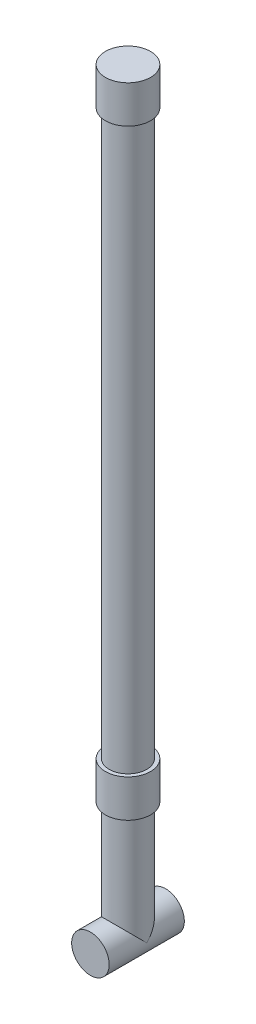
ISO-10303-21;
HEADER;
FILE_DESCRIPTION(('STEP AP214'),'2;1');
FILE_NAME('part.step','',(''),(''),'','','');
FILE_SCHEMA(('AUTOMOTIVE_DESIGN { 1 0 10303 214 1 1 1 1 }'));
ENDSEC;
DATA;
#1=APPLICATION_CONTEXT('core data for automotive mechanical design processes');
#2=APPLICATION_PROTOCOL_DEFINITION('international standard','automotive_design',2000,#1);
#3=PRODUCT_CONTEXT('',#1,'mechanical');
#4=PRODUCT('Part','Part','',(#3));
#5=PRODUCT_RELATED_PRODUCT_CATEGORY('part','',(#4));
#6=PRODUCT_DEFINITION_FORMATION('','',#4);
#7=PRODUCT_DEFINITION_CONTEXT('part definition',#1,'design');
#8=PRODUCT_DEFINITION('design','',#6,#7);
#9=PRODUCT_DEFINITION_SHAPE('','',#8);
#10=(LENGTH_UNIT() NAMED_UNIT(*) SI_UNIT(.MILLI.,.METRE.));
#11=(NAMED_UNIT(*) PLANE_ANGLE_UNIT() SI_UNIT($,.RADIAN.));
#12=(NAMED_UNIT(*) SI_UNIT($,.STERADIAN.) SOLID_ANGLE_UNIT());
#13=UNCERTAINTY_MEASURE_WITH_UNIT(LENGTH_MEASURE(1.E-05),#10,'distance_accuracy_value','');
#14=(GEOMETRIC_REPRESENTATION_CONTEXT(3) GLOBAL_UNCERTAINTY_ASSIGNED_CONTEXT((#13)) GLOBAL_UNIT_ASSIGNED_CONTEXT((#10,
#11,#12)) REPRESENTATION_CONTEXT('',''));
#15=CARTESIAN_POINT('',(0.,0.,0.));
#16=DIRECTION('',(0.,0.,1.));
#17=DIRECTION('',(1.,0.,0.));
#18=AXIS2_PLACEMENT_3D('',#15,#16,#17);
#19=CARTESIAN_POINT('',(0.,200.,0.));
#20=DIRECTION('',(0.,-1.,0.));
#21=DIRECTION('',(0.,0.,-1.));
#22=AXIS2_PLACEMENT_3D('',#19,#20,#21);
#23=CYLINDRICAL_SURFACE('',#22,5.);
#24=CARTESIAN_POINT('',(0.,40.,0.));
#25=DIRECTION('',(0.,1.,0.));
#26=DIRECTION('',(-1.,0.,0.));
#27=AXIS2_PLACEMENT_3D('',#24,#25,#26);
#28=CIRCLE('',#27,5.);
#29=CARTESIAN_POINT('',(-5.,40.,0.));
#30=VERTEX_POINT('',#29);
#31=EDGE_CURVE('E62',#30,#30,#28,.T.);
#32=ORIENTED_EDGE('',*,*,#31,.T.);
#33=EDGE_LOOP('',(#32));
#34=FACE_BOUND('',#33,.T.);
#35=CARTESIAN_POINT('',(0.,190.,0.));
#36=DIRECTION('',(0.,1.,0.));
#37=DIRECTION('',(0.,0.,1.));
#38=AXIS2_PLACEMENT_3D('',#35,#36,#37);
#39=CIRCLE('',#38,5.);
#40=CARTESIAN_POINT('',(0.,190.,5.));
#41=VERTEX_POINT('',#40);
#42=EDGE_CURVE('E12',#41,#41,#39,.T.);
#43=ORIENTED_EDGE('',*,*,#42,.F.);
#44=EDGE_LOOP('',(#43));
#45=FACE_BOUND('',#44,.T.);
#46=ADVANCED_FACE('F36',(#34,#45),#23,.T.);
#47=CARTESIAN_POINT('',(0.,0.,0.));
#48=DIRECTION('',(0.,-0.707106781186547,-0.707106781186547));
#49=DIRECTION('',(0.,-0.707106781186547,0.707106781186547));
#50=AXIS2_PLACEMENT_3D('',#47,#48,#49);
#51=ELLIPSE('',#50,7.07106781186547,5.);
#52=CARTESIAN_POINT('',(5.,0.,0.));
#53=VERTEX_POINT('',#52);
#54=CARTESIAN_POINT('',(-5.,0.,0.));
#55=VERTEX_POINT('',#54);
#56=EDGE_CURVE('E51',#53,#55,#51,.F.);
#57=ORIENTED_EDGE('',*,*,#56,.T.);
#58=CARTESIAN_POINT('',(0.,0.,0.));
#59=DIRECTION('',(0.,-0.707106781186547,0.707106781186547));
#60=DIRECTION('',(0.,-0.707106781186547,-0.707106781186547));
#61=AXIS2_PLACEMENT_3D('',#58,#59,#60);
#62=ELLIPSE('',#61,7.07106781186547,5.);
#63=EDGE_CURVE('E49',#55,#53,#62,.F.);
#64=ORIENTED_EDGE('',*,*,#63,.T.);
#65=EDGE_LOOP('',(#57,#64));
#66=FACE_BOUND('',#65,.T.);
#67=CARTESIAN_POINT('',(0.,30.,0.));
#68=DIRECTION('',(0.,1.,0.));
#69=DIRECTION('',(-1.,0.,0.));
#70=AXIS2_PLACEMENT_3D('',#67,#68,#69);
#71=CIRCLE('',#70,5.);
#72=CARTESIAN_POINT('',(-5.,30.,0.));
#73=VERTEX_POINT('',#72);
#74=EDGE_CURVE('E43',#73,#73,#71,.T.);
#75=ORIENTED_EDGE('',*,*,#74,.F.);
#76=EDGE_LOOP('',(#75));
#77=FACE_BOUND('',#76,.T.);
#78=ADVANCED_FACE('F56',(#66,#77),#23,.T.);
#79=CARTESIAN_POINT('',(0.,0.,-10.));
#80=DIRECTION('',(0.,0.,1.));
#81=DIRECTION('',(1.,0.,0.));
#82=AXIS2_PLACEMENT_3D('',#79,#80,#81);
#83=CYLINDRICAL_SURFACE('',#82,5.);
#84=CARTESIAN_POINT('',(0.,0.,10.));
#85=DIRECTION('',(0.,0.,1.));
#86=DIRECTION('',(1.,0.,0.));
#87=AXIS2_PLACEMENT_3D('',#84,#85,#86);
#88=CIRCLE('',#87,5.);
#89=CARTESIAN_POINT('',(5.,0.,10.));
#90=VERTEX_POINT('',#89);
#91=EDGE_CURVE('E64',#90,#90,#88,.T.);
#92=ORIENTED_EDGE('',*,*,#91,.F.);
#93=EDGE_LOOP('',(#92));
#94=FACE_BOUND('',#93,.T.);
#95=CARTESIAN_POINT('',(0.,0.,-10.));
#96=DIRECTION('',(0.,0.,1.));
#97=DIRECTION('',(1.,0.,0.));
#98=AXIS2_PLACEMENT_3D('',#95,#96,#97);
#99=CIRCLE('',#98,5.);
#100=CARTESIAN_POINT('',(5.,0.,-10.));
#101=VERTEX_POINT('',#100);
#102=EDGE_CURVE('E54',#101,#101,#99,.T.);
#103=ORIENTED_EDGE('',*,*,#102,.T.);
#104=EDGE_LOOP('',(#103));
#105=FACE_BOUND('',#104,.T.);
#106=ORIENTED_EDGE('',*,*,#63,.F.);
#107=ORIENTED_EDGE('',*,*,#56,.F.);
#108=EDGE_LOOP('',(#106,#107));
#109=FACE_BOUND('',#108,.T.);
#110=ADVANCED_FACE('F52',(#94,#105,#109),#83,.T.);
#111=CARTESIAN_POINT('',(0.,0.,-10.));
#112=DIRECTION('',(0.,0.,1.));
#113=DIRECTION('',(1.,0.,0.));
#114=AXIS2_PLACEMENT_3D('',#111,#112,#113);
#115=PLANE('',#114);
#116=ORIENTED_EDGE('',*,*,#102,.F.);
#117=EDGE_LOOP('',(#116));
#118=FACE_BOUND('',#117,.T.);
#119=ADVANCED_FACE('F83',(#118),#115,.F.);
#120=CARTESIAN_POINT('',(0.,0.,10.));
#121=DIRECTION('',(0.,0.,1.));
#122=DIRECTION('',(1.,0.,0.));
#123=AXIS2_PLACEMENT_3D('',#120,#121,#122);
#124=PLANE('',#123);
#125=ORIENTED_EDGE('',*,*,#91,.T.);
#126=EDGE_LOOP('',(#125));
#127=FACE_BOUND('',#126,.T.);
#128=ADVANCED_FACE('F85',(#127),#124,.T.);
#129=CARTESIAN_POINT('',(0.,30.,0.));
#130=DIRECTION('',(0.,1.,0.));
#131=DIRECTION('',(-1.,0.,0.));
#132=AXIS2_PLACEMENT_3D('',#129,#130,#131);
#133=PLANE('',#132);
#134=CARTESIAN_POINT('',(0.,30.,0.));
#135=DIRECTION('',(0.,1.,0.));
#136=DIRECTION('',(0.,0.,1.));
#137=AXIS2_PLACEMENT_3D('',#134,#135,#136);
#138=CIRCLE('',#137,6.);
#139=CARTESIAN_POINT('',(0.,30.,6.));
#140=VERTEX_POINT('',#139);
#141=EDGE_CURVE('E71',#140,#140,#138,.T.);
#142=ORIENTED_EDGE('',*,*,#141,.F.);
#143=EDGE_LOOP('',(#142));
#144=FACE_BOUND('',#143,.T.);
#145=ORIENTED_EDGE('',*,*,#74,.T.);
#146=EDGE_LOOP('',(#145));
#147=FACE_BOUND('',#146,.T.);
#148=ADVANCED_FACE('F91',(#144,#147),#133,.F.);
#149=CARTESIAN_POINT('',(0.,40.,0.));
#150=DIRECTION('',(0.,1.,0.));
#151=DIRECTION('',(-1.,0.,0.));
#152=AXIS2_PLACEMENT_3D('',#149,#150,#151);
#153=PLANE('',#152);
#154=CARTESIAN_POINT('',(0.,40.,0.));
#155=DIRECTION('',(0.,1.,0.));
#156=DIRECTION('',(0.,0.,1.));
#157=AXIS2_PLACEMENT_3D('',#154,#155,#156);
#158=CIRCLE('',#157,6.);
#159=CARTESIAN_POINT('',(0.,40.,6.));
#160=VERTEX_POINT('',#159);
#161=EDGE_CURVE('E65',#160,#160,#158,.T.);
#162=ORIENTED_EDGE('',*,*,#161,.T.);
#163=EDGE_LOOP('',(#162));
#164=FACE_BOUND('',#163,.T.);
#165=ORIENTED_EDGE('',*,*,#31,.F.);
#166=EDGE_LOOP('',(#165));
#167=FACE_BOUND('',#166,.T.);
#168=ADVANCED_FACE('F116',(#164,#167),#153,.T.);
#169=CARTESIAN_POINT('',(0.,30.,0.));
#170=DIRECTION('',(0.,1.,0.));
#171=DIRECTION('',(0.,0.,1.));
#172=AXIS2_PLACEMENT_3D('',#169,#170,#171);
#173=CYLINDRICAL_SURFACE('',#172,6.);
#174=ORIENTED_EDGE('',*,*,#141,.T.);
#175=EDGE_LOOP('',(#174));
#176=FACE_BOUND('',#175,.T.);
#177=ORIENTED_EDGE('',*,*,#161,.F.);
#178=EDGE_LOOP('',(#177));
#179=FACE_BOUND('',#178,.T.);
#180=ADVANCED_FACE('F106',(#176,#179),#173,.T.);
#181=CARTESIAN_POINT('',(0.,190.,0.));
#182=DIRECTION('',(0.,1.,0.));
#183=DIRECTION('',(0.,0.,1.));
#184=AXIS2_PLACEMENT_3D('',#181,#182,#183);
#185=PLANE('',#184);
#186=CARTESIAN_POINT('',(0.,190.,0.));
#187=DIRECTION('',(0.,1.,0.));
#188=DIRECTION('',(0.,0.,1.));
#189=AXIS2_PLACEMENT_3D('',#186,#187,#188);
#190=CIRCLE('',#189,6.);
#191=CARTESIAN_POINT('',(0.,190.,6.));
#192=VERTEX_POINT('',#191);
#193=EDGE_CURVE('E76',#192,#192,#190,.T.);
#194=ORIENTED_EDGE('',*,*,#193,.F.);
#195=EDGE_LOOP('',(#194));
#196=FACE_BOUND('',#195,.T.);
#197=ORIENTED_EDGE('',*,*,#42,.T.);
#198=EDGE_LOOP('',(#197));
#199=FACE_BOUND('',#198,.T.);
#200=ADVANCED_FACE('F103',(#196,#199),#185,.F.);
#201=CARTESIAN_POINT('',(0.,190.,0.));
#202=DIRECTION('',(0.,1.,0.));
#203=DIRECTION('',(0.,0.,1.));
#204=AXIS2_PLACEMENT_3D('',#201,#202,#203);
#205=CYLINDRICAL_SURFACE('',#204,6.);
#206=ORIENTED_EDGE('',*,*,#193,.T.);
#207=EDGE_LOOP('',(#206));
#208=FACE_BOUND('',#207,.T.);
#209=CARTESIAN_POINT('',(0.,200.,0.));
#210=DIRECTION('',(0.,1.,0.));
#211=DIRECTION('',(0.,0.,1.));
#212=AXIS2_PLACEMENT_3D('',#209,#210,#211);
#213=CIRCLE('',#212,6.);
#214=CARTESIAN_POINT('',(0.,200.,6.));
#215=VERTEX_POINT('',#214);
#216=EDGE_CURVE('E196',#215,#215,#213,.T.);
#217=ORIENTED_EDGE('',*,*,#216,.F.);
#218=EDGE_LOOP('',(#217));
#219=FACE_BOUND('',#218,.T.);
#220=ADVANCED_FACE('F105',(#208,#219),#205,.T.);
#221=CARTESIAN_POINT('',(0.,200.,0.));
#222=DIRECTION('',(0.,1.,0.));
#223=DIRECTION('',(0.,0.,1.));
#224=AXIS2_PLACEMENT_3D('',#221,#222,#223);
#225=PLANE('',#224);
#226=ORIENTED_EDGE('',*,*,#216,.T.);
#227=EDGE_LOOP('',(#226));
#228=FACE_BOUND('',#227,.T.);
#229=ADVANCED_FACE('F113',(#228),#225,.T.);
#230=CLOSED_SHELL('',(#46,#78,#110,#119,#128,#148,#168,#180,#200,#220,#229));
#231=MANIFOLD_SOLID_BREP('B2',#230);
#232=ADVANCED_BREP_SHAPE_REPRESENTATION('',(#18,#231),#14);
#233=SHAPE_DEFINITION_REPRESENTATION(#9,#232);
ENDSEC;
END-ISO-10303-21;
